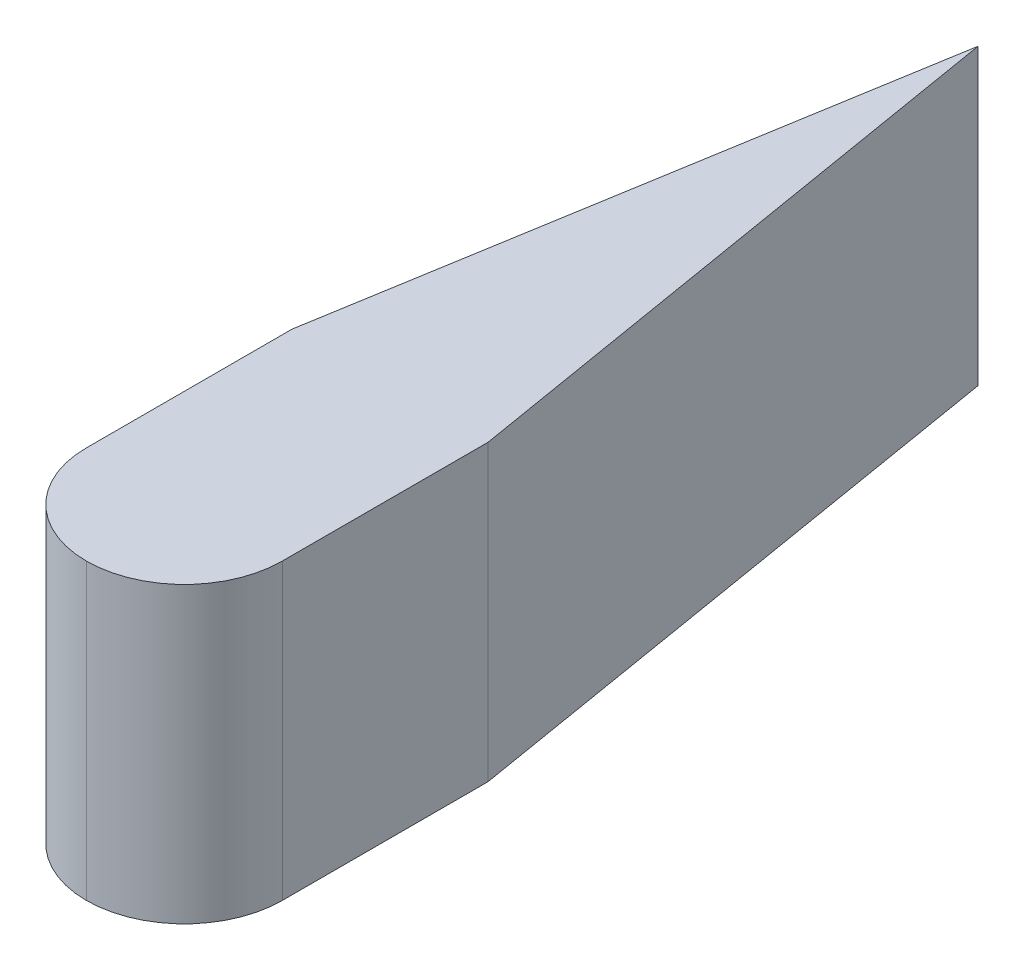
ISO-10303-21;
HEADER;
FILE_DESCRIPTION(('STEP AP214'),'2;1');
FILE_NAME('part.step','',(''),(''),'','','');
FILE_SCHEMA(('AUTOMOTIVE_DESIGN { 1 0 10303 214 1 1 1 1 }'));
ENDSEC;
DATA;
#1=APPLICATION_CONTEXT('core data for automotive mechanical design processes');
#2=APPLICATION_PROTOCOL_DEFINITION('international standard','automotive_design',2000,#1);
#3=PRODUCT_CONTEXT('',#1,'mechanical');
#4=PRODUCT('Part','Part','',(#3));
#5=PRODUCT_RELATED_PRODUCT_CATEGORY('part','',(#4));
#6=PRODUCT_DEFINITION_FORMATION('','',#4);
#7=PRODUCT_DEFINITION_CONTEXT('part definition',#1,'design');
#8=PRODUCT_DEFINITION('design','',#6,#7);
#9=PRODUCT_DEFINITION_SHAPE('','',#8);
#10=(LENGTH_UNIT() NAMED_UNIT(*) SI_UNIT(.MILLI.,.METRE.));
#11=(NAMED_UNIT(*) PLANE_ANGLE_UNIT() SI_UNIT($,.RADIAN.));
#12=(NAMED_UNIT(*) SI_UNIT($,.STERADIAN.) SOLID_ANGLE_UNIT());
#13=UNCERTAINTY_MEASURE_WITH_UNIT(LENGTH_MEASURE(1.E-05),#10,'distance_accuracy_value','');
#14=(GEOMETRIC_REPRESENTATION_CONTEXT(3) GLOBAL_UNCERTAINTY_ASSIGNED_CONTEXT((#13)) GLOBAL_UNIT_ASSIGNED_CONTEXT((#10,
#11,#12)) REPRESENTATION_CONTEXT('',''));
#15=CARTESIAN_POINT('',(0.,0.,0.));
#16=DIRECTION('',(0.,0.,1.));
#17=DIRECTION('',(1.,0.,0.));
#18=AXIS2_PLACEMENT_3D('',#15,#16,#17);
#19=CARTESIAN_POINT('',(0.,19.05,-38.1));
#20=DIRECTION('',(-0.986393923832144,0.,0.164398987305357));
#21=DIRECTION('',(0.164398987305357,0.,0.986393923832144));
#22=AXIS2_PLACEMENT_3D('',#19,#20,#21);
#23=PLANE('',#22);
#24=DIRECTION('',(-0.164398987305357,0.,-0.986393923832144));
#25=VECTOR('',#24,1.);
#26=CARTESIAN_POINT('',(0.,0.,-38.1));
#27=LINE('',#26,#25);
#28=CARTESIAN_POINT('',(6.35,0.,0.));
#29=VERTEX_POINT('',#28);
#30=CARTESIAN_POINT('',(0.,0.,-38.1));
#31=VERTEX_POINT('',#30);
#32=EDGE_CURVE('E116',#29,#31,#27,.T.);
#33=ORIENTED_EDGE('',*,*,#32,.T.);
#34=DIRECTION('',(0.,-1.,0.));
#35=VECTOR('',#34,1.);
#36=CARTESIAN_POINT('',(0.,19.05,-38.1));
#37=LINE('',#36,#35);
#38=CARTESIAN_POINT('',(0.,19.05,-38.1));
#39=VERTEX_POINT('',#38);
#40=EDGE_CURVE('E99',#39,#31,#37,.T.);
#41=ORIENTED_EDGE('',*,*,#40,.F.);
#42=DIRECTION('',(-0.164398987305357,0.,-0.986393923832144));
#43=VECTOR('',#42,1.);
#44=CARTESIAN_POINT('',(0.,19.05,-38.1));
#45=LINE('',#44,#43);
#46=CARTESIAN_POINT('',(6.35,19.05,0.));
#47=VERTEX_POINT('',#46);
#48=EDGE_CURVE('E105',#47,#39,#45,.T.);
#49=ORIENTED_EDGE('',*,*,#48,.F.);
#50=DIRECTION('',(0.,-1.,0.));
#51=VECTOR('',#50,1.);
#52=CARTESIAN_POINT('',(6.35,19.05,0.));
#53=LINE('',#52,#51);
#54=EDGE_CURVE('E121',#47,#29,#53,.T.);
#55=ORIENTED_EDGE('',*,*,#54,.T.);
#56=EDGE_LOOP('',(#33,#41,#49,#55));
#57=FACE_BOUND('',#56,.T.);
#58=ADVANCED_FACE('F45',(#57),#23,.F.);
#59=CARTESIAN_POINT('',(0.,19.05,-38.1));
#60=DIRECTION('',(0.986393923832144,0.,0.164398987305357));
#61=DIRECTION('',(0.164398987305357,0.,-0.986393923832144));
#62=AXIS2_PLACEMENT_3D('',#59,#60,#61);
#63=PLANE('',#62);
#64=DIRECTION('',(-0.164398987305357,0.,0.986393923832144));
#65=VECTOR('',#64,1.);
#66=CARTESIAN_POINT('',(0.,0.,-38.1));
#67=LINE('',#66,#65);
#68=CARTESIAN_POINT('',(-6.35,0.,0.));
#69=VERTEX_POINT('',#68);
#70=EDGE_CURVE('E142',#31,#69,#67,.T.);
#71=ORIENTED_EDGE('',*,*,#70,.T.);
#72=DIRECTION('',(0.,-1.,0.));
#73=VECTOR('',#72,1.);
#74=CARTESIAN_POINT('',(-6.35,19.05,0.));
#75=LINE('',#74,#73);
#76=CARTESIAN_POINT('',(-6.35,19.05,0.));
#77=VERTEX_POINT('',#76);
#78=EDGE_CURVE('E102',#77,#69,#75,.T.);
#79=ORIENTED_EDGE('',*,*,#78,.F.);
#80=DIRECTION('',(-0.164398987305357,0.,0.986393923832144));
#81=VECTOR('',#80,1.);
#82=CARTESIAN_POINT('',(0.,19.05,-38.1));
#83=LINE('',#82,#81);
#84=EDGE_CURVE('E95',#39,#77,#83,.T.);
#85=ORIENTED_EDGE('',*,*,#84,.F.);
#86=ORIENTED_EDGE('',*,*,#40,.T.);
#87=EDGE_LOOP('',(#71,#79,#85,#86));
#88=FACE_BOUND('',#87,.T.);
#89=ADVANCED_FACE('F97',(#88),#63,.F.);
#90=CARTESIAN_POINT('',(-6.35,19.05,0.));
#91=DIRECTION('',(1.,0.,0.));
#92=DIRECTION('',(0.,0.,-1.));
#93=AXIS2_PLACEMENT_3D('',#90,#91,#92);
#94=PLANE('',#93);
#95=DIRECTION('',(0.,0.,1.));
#96=VECTOR('',#95,1.);
#97=CARTESIAN_POINT('',(-6.35,0.,0.));
#98=LINE('',#97,#96);
#99=CARTESIAN_POINT('',(-6.35,0.,13.335));
#100=VERTEX_POINT('',#99);
#101=EDGE_CURVE('E135',#69,#100,#98,.T.);
#102=ORIENTED_EDGE('',*,*,#101,.T.);
#103=DIRECTION('',(0.,-1.,0.));
#104=VECTOR('',#103,1.);
#105=CARTESIAN_POINT('',(-6.35,19.05,13.335));
#106=LINE('',#105,#104);
#107=CARTESIAN_POINT('',(-6.35,19.05,13.335));
#108=VERTEX_POINT('',#107);
#109=EDGE_CURVE('E126',#100,#108,#106,.F.);
#110=ORIENTED_EDGE('',*,*,#109,.T.);
#111=DIRECTION('',(0.,0.,1.));
#112=VECTOR('',#111,1.);
#113=CARTESIAN_POINT('',(-6.35,19.05,0.));
#114=LINE('',#113,#112);
#115=EDGE_CURVE('E104',#77,#108,#114,.T.);
#116=ORIENTED_EDGE('',*,*,#115,.F.);
#117=ORIENTED_EDGE('',*,*,#78,.T.);
#118=EDGE_LOOP('',(#102,#110,#116,#117));
#119=FACE_BOUND('',#118,.T.);
#120=ADVANCED_FACE('F133',(#119),#94,.F.);
#121=CARTESIAN_POINT('',(6.35,19.05,0.));
#122=DIRECTION('',(-1.,0.,0.));
#123=DIRECTION('',(0.,0.,1.));
#124=AXIS2_PLACEMENT_3D('',#121,#122,#123);
#125=PLANE('',#124);
#126=DIRECTION('',(0.,0.,-1.));
#127=VECTOR('',#126,1.);
#128=CARTESIAN_POINT('',(6.35,19.05,0.));
#129=LINE('',#128,#127);
#130=CARTESIAN_POINT('',(6.35,19.05,13.335));
#131=VERTEX_POINT('',#130);
#132=EDGE_CURVE('E109',#131,#47,#129,.T.);
#133=ORIENTED_EDGE('',*,*,#132,.F.);
#134=DIRECTION('',(0.,-1.,0.));
#135=VECTOR('',#134,1.);
#136=CARTESIAN_POINT('',(6.35,19.05,13.335));
#137=LINE('',#136,#135);
#138=CARTESIAN_POINT('',(6.35,0.,13.335));
#139=VERTEX_POINT('',#138);
#140=EDGE_CURVE('E11',#131,#139,#137,.T.);
#141=ORIENTED_EDGE('',*,*,#140,.T.);
#142=DIRECTION('',(0.,0.,-1.));
#143=VECTOR('',#142,1.);
#144=CARTESIAN_POINT('',(6.35,0.,0.));
#145=LINE('',#144,#143);
#146=EDGE_CURVE('E113',#139,#29,#145,.T.);
#147=ORIENTED_EDGE('',*,*,#146,.T.);
#148=ORIENTED_EDGE('',*,*,#54,.F.);
#149=EDGE_LOOP('',(#133,#141,#147,#148));
#150=FACE_BOUND('',#149,.T.);
#151=ADVANCED_FACE('F174',(#150),#125,.F.);
#152=CARTESIAN_POINT('',(0.,19.05,0.));
#153=DIRECTION('',(0.,1.,0.));
#154=DIRECTION('',(0.,0.,1.));
#155=AXIS2_PLACEMENT_3D('',#152,#153,#154);
#156=PLANE('',#155);
#157=ORIENTED_EDGE('',*,*,#115,.T.);
#158=CARTESIAN_POINT('',(0.,19.05,13.335));
#159=DIRECTION('',(0.,1.,0.));
#160=DIRECTION('',(0.,0.,1.));
#161=AXIS2_PLACEMENT_3D('',#158,#159,#160);
#162=CIRCLE('',#161,6.35);
#163=CARTESIAN_POINT('',(0.,19.05,19.685));
#164=VERTEX_POINT('',#163);
#165=EDGE_CURVE('E54',#108,#164,#162,.T.);
#166=ORIENTED_EDGE('',*,*,#165,.T.);
#167=CARTESIAN_POINT('',(0.,19.05,13.335));
#168=DIRECTION('',(0.,1.,0.));
#169=DIRECTION('',(0.,0.,1.));
#170=AXIS2_PLACEMENT_3D('',#167,#168,#169);
#171=CIRCLE('',#170,6.35);
#172=EDGE_CURVE('E61',#164,#131,#171,.T.);
#173=ORIENTED_EDGE('',*,*,#172,.T.);
#174=ORIENTED_EDGE('',*,*,#132,.T.);
#175=ORIENTED_EDGE('',*,*,#48,.T.);
#176=ORIENTED_EDGE('',*,*,#84,.T.);
#177=EDGE_LOOP('',(#157,#166,#173,#174,#175,#176));
#178=FACE_BOUND('',#177,.T.);
#179=ADVANCED_FACE('F108',(#178),#156,.T.);
#180=CARTESIAN_POINT('',(0.,0.,0.));
#181=DIRECTION('',(0.,1.,0.));
#182=DIRECTION('',(0.,0.,1.));
#183=AXIS2_PLACEMENT_3D('',#180,#181,#182);
#184=PLANE('',#183);
#185=CARTESIAN_POINT('',(-9.43689570931383E-13,0.,13.6216503252901));
#186=DIRECTION('',(0.,-1.,0.));
#187=DIRECTION('',(0.,0.,-1.));
#188=AXIS2_PLACEMENT_3D('',#185,#186,#187);
#189=CIRCLE('',#188,3.35362189142521);
#190=CARTESIAN_POINT('',(-9.43689570931383E-13,0.,10.2680284338649));
#191=VERTEX_POINT('',#190);
#192=EDGE_CURVE('E156',#191,#191,#189,.T.);
#193=ORIENTED_EDGE('',*,*,#192,.F.);
#194=EDGE_LOOP('',(#193));
#195=FACE_BOUND('',#194,.T.);
#196=CARTESIAN_POINT('',(0.,0.,13.335));
#197=DIRECTION('',(0.,1.,0.));
#198=DIRECTION('',(0.,0.,1.));
#199=AXIS2_PLACEMENT_3D('',#196,#197,#198);
#200=CIRCLE('',#199,6.35);
#201=CARTESIAN_POINT('',(0.,0.,19.685));
#202=VERTEX_POINT('',#201);
#203=EDGE_CURVE('E117',#139,#202,#200,.F.);
#204=ORIENTED_EDGE('',*,*,#203,.T.);
#205=CARTESIAN_POINT('',(0.,0.,13.335));
#206=DIRECTION('',(0.,1.,0.));
#207=DIRECTION('',(0.,0.,1.));
#208=AXIS2_PLACEMENT_3D('',#205,#206,#207);
#209=CIRCLE('',#208,6.35);
#210=EDGE_CURVE('E119',#202,#100,#209,.F.);
#211=ORIENTED_EDGE('',*,*,#210,.T.);
#212=ORIENTED_EDGE('',*,*,#101,.F.);
#213=ORIENTED_EDGE('',*,*,#70,.F.);
#214=ORIENTED_EDGE('',*,*,#32,.F.);
#215=ORIENTED_EDGE('',*,*,#146,.F.);
#216=EDGE_LOOP('',(#204,#211,#212,#213,#214,#215));
#217=FACE_BOUND('',#216,.T.);
#218=ADVANCED_FACE('F148',(#195,#217),#184,.F.);
#219=CARTESIAN_POINT('',(0.,19.05,13.335));
#220=DIRECTION('',(0.,-1.,0.));
#221=DIRECTION('',(0.,0.,-1.));
#222=AXIS2_PLACEMENT_3D('',#219,#220,#221);
#223=CYLINDRICAL_SURFACE('',#222,6.35);
#224=ORIENTED_EDGE('',*,*,#140,.F.);
#225=ORIENTED_EDGE('',*,*,#172,.F.);
#226=DIRECTION('',(0.,-1.,0.));
#227=VECTOR('',#226,1.);
#228=CARTESIAN_POINT('',(0.,19.05,19.685));
#229=LINE('',#228,#227);
#230=EDGE_CURVE('E49',#202,#164,#229,.F.);
#231=ORIENTED_EDGE('',*,*,#230,.F.);
#232=ORIENTED_EDGE('',*,*,#203,.F.);
#233=EDGE_LOOP('',(#224,#225,#231,#232));
#234=FACE_BOUND('',#233,.T.);
#235=ADVANCED_FACE('F47',(#234),#223,.T.);
#236=CARTESIAN_POINT('',(0.,19.05,13.335));
#237=DIRECTION('',(0.,-1.,0.));
#238=DIRECTION('',(0.,0.,-1.));
#239=AXIS2_PLACEMENT_3D('',#236,#237,#238);
#240=CYLINDRICAL_SURFACE('',#239,6.35);
#241=ORIENTED_EDGE('',*,*,#165,.F.);
#242=ORIENTED_EDGE('',*,*,#109,.F.);
#243=ORIENTED_EDGE('',*,*,#210,.F.);
#244=ORIENTED_EDGE('',*,*,#230,.T.);
#245=EDGE_LOOP('',(#241,#242,#243,#244));
#246=FACE_BOUND('',#245,.T.);
#247=ADVANCED_FACE('F152',(#246),#240,.T.);
#248=CARTESIAN_POINT('',(-9.43689570931383E-13,12.7,13.6216503252901));
#249=DIRECTION('',(0.,-1.,0.));
#250=DIRECTION('',(0.,0.,-1.));
#251=AXIS2_PLACEMENT_3D('',#248,#249,#250);
#252=CYLINDRICAL_SURFACE('',#251,3.35362189142521);
#253=CARTESIAN_POINT('',(-9.43689570931383E-13,12.7,13.6216503252901));
#254=DIRECTION('',(0.,-1.,0.));
#255=DIRECTION('',(0.,0.,-1.));
#256=AXIS2_PLACEMENT_3D('',#253,#254,#255);
#257=CIRCLE('',#256,3.35362189142521);
#258=CARTESIAN_POINT('',(-9.43689570931383E-13,12.7,10.2680284338649));
#259=VERTEX_POINT('',#258);
#260=EDGE_CURVE('E154',#259,#259,#257,.T.);
#261=ORIENTED_EDGE('',*,*,#260,.F.);
#262=EDGE_LOOP('',(#261));
#263=FACE_BOUND('',#262,.T.);
#264=ORIENTED_EDGE('',*,*,#192,.T.);
#265=EDGE_LOOP('',(#264));
#266=FACE_BOUND('',#265,.T.);
#267=ADVANCED_FACE('F164',(#263,#266),#252,.F.);
#268=CARTESIAN_POINT('',(0.,12.7,0.));
#269=DIRECTION('',(0.,-1.,0.));
#270=DIRECTION('',(0.,0.,-1.));
#271=AXIS2_PLACEMENT_3D('',#268,#269,#270);
#272=PLANE('',#271);
#273=ORIENTED_EDGE('',*,*,#260,.T.);
#274=EDGE_LOOP('',(#273));
#275=FACE_BOUND('',#274,.T.);
#276=ADVANCED_FACE('F186',(#275),#272,.T.);
#277=CLOSED_SHELL('',(#58,#89,#120,#151,#179,#218,#235,#247,#267,#276));
#278=MANIFOLD_SOLID_BREP('B2',#277);
#279=ADVANCED_BREP_SHAPE_REPRESENTATION('',(#18,#278),#14);
#280=SHAPE_DEFINITION_REPRESENTATION(#9,#279);
ENDSEC;
END-ISO-10303-21;
